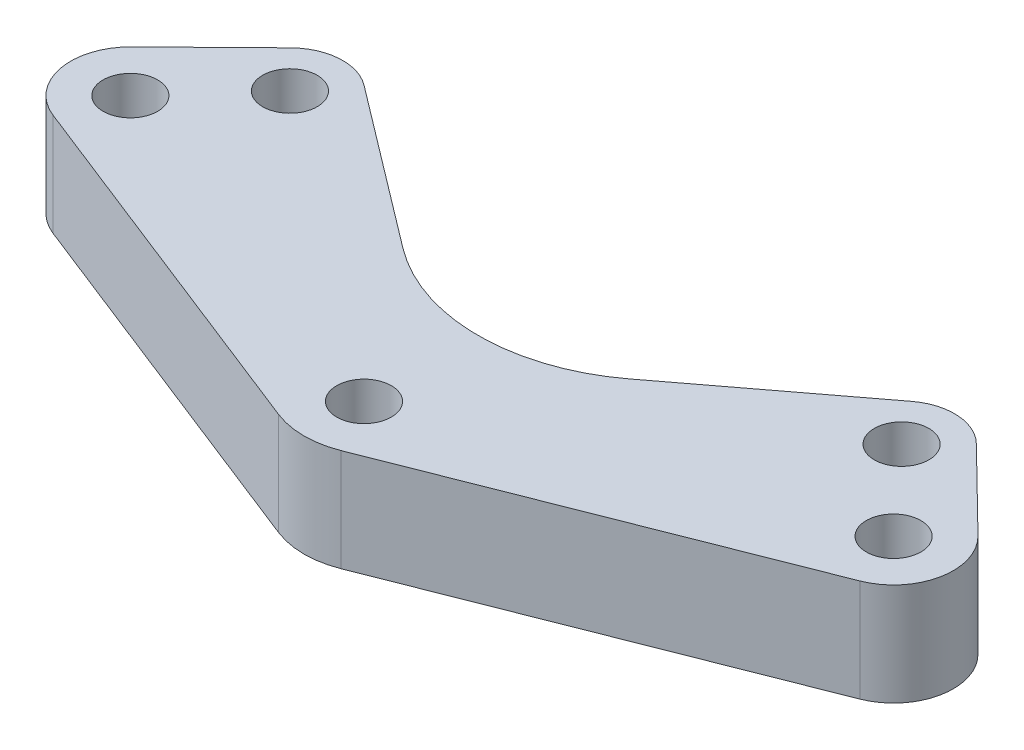
ISO-10303-21;
HEADER;
FILE_DESCRIPTION(('STEP AP214'),'2;1');
FILE_NAME('part.step','',(''),(''),'','','');
FILE_SCHEMA(('AUTOMOTIVE_DESIGN { 1 0 10303 214 1 1 1 1 }'));
ENDSEC;
DATA;
#1=APPLICATION_CONTEXT('core data for automotive mechanical design processes');
#2=APPLICATION_PROTOCOL_DEFINITION('international standard','automotive_design',2000,#1);
#3=PRODUCT_CONTEXT('',#1,'mechanical');
#4=PRODUCT('Part','Part','',(#3));
#5=PRODUCT_RELATED_PRODUCT_CATEGORY('part','',(#4));
#6=PRODUCT_DEFINITION_FORMATION('','',#4);
#7=PRODUCT_DEFINITION_CONTEXT('part definition',#1,'design');
#8=PRODUCT_DEFINITION('design','',#6,#7);
#9=PRODUCT_DEFINITION_SHAPE('','',#8);
#10=(LENGTH_UNIT() NAMED_UNIT(*) SI_UNIT(.MILLI.,.METRE.));
#11=(NAMED_UNIT(*) PLANE_ANGLE_UNIT() SI_UNIT($,.RADIAN.));
#12=(NAMED_UNIT(*) SI_UNIT($,.STERADIAN.) SOLID_ANGLE_UNIT());
#13=UNCERTAINTY_MEASURE_WITH_UNIT(LENGTH_MEASURE(1.E-05),#10,'distance_accuracy_value','');
#14=(GEOMETRIC_REPRESENTATION_CONTEXT(3) GLOBAL_UNCERTAINTY_ASSIGNED_CONTEXT((#13)) GLOBAL_UNIT_ASSIGNED_CONTEXT((#10,
#11,#12)) REPRESENTATION_CONTEXT('',''));
#15=CARTESIAN_POINT('',(0.,0.,0.));
#16=DIRECTION('',(0.,0.,1.));
#17=DIRECTION('',(1.,0.,0.));
#18=AXIS2_PLACEMENT_3D('',#15,#16,#17);
#19=CARTESIAN_POINT('',(22.3766543909561,0.,-8.67671241126073));
#20=DIRECTION('',(0.,-1.,0.));
#21=DIRECTION('',(0.,0.,-1.));
#22=AXIS2_PLACEMENT_3D('',#19,#20,#21);
#23=CYLINDRICAL_SURFACE('',#22,3.4999999999999);
#24=CARTESIAN_POINT('',(22.3766543909561,-6.,-8.67671241126073));
#25=DIRECTION('',(0.,-1.,0.));
#26=DIRECTION('',(0.,0.,-1.));
#27=AXIS2_PLACEMENT_3D('',#24,#25,#26);
#28=CIRCLE('',#27,3.4999999999999);
#29=CARTESIAN_POINT('',(24.8257440346938,-6.,-11.1771043639226));
#30=VERTEX_POINT('',#29);
#31=CARTESIAN_POINT('',(23.6582391462739,-6.,-5.41979047253755));
#32=VERTEX_POINT('',#31);
#33=EDGE_CURVE('E158',#30,#32,#28,.T.);
#34=ORIENTED_EDGE('',*,*,#33,.F.);
#35=DIRECTION('',(0.,-1.,0.));
#36=VECTOR('',#35,1.);
#37=CARTESIAN_POINT('',(24.8257440346938,0.,-11.1771043639226));
#38=LINE('',#37,#36);
#39=CARTESIAN_POINT('',(24.8257440346938,0.,-11.1771043639226));
#40=VERTEX_POINT('',#39);
#41=EDGE_CURVE('E11',#40,#30,#38,.T.);
#42=ORIENTED_EDGE('',*,*,#41,.F.);
#43=CARTESIAN_POINT('',(22.3766543909561,0.,-8.67671241126073));
#44=DIRECTION('',(0.,-1.,0.));
#45=DIRECTION('',(0.,0.,-1.));
#46=AXIS2_PLACEMENT_3D('',#43,#44,#45);
#47=CIRCLE('',#46,3.4999999999999);
#48=CARTESIAN_POINT('',(23.6582391462739,0.,-5.41979047253755));
#49=VERTEX_POINT('',#48);
#50=EDGE_CURVE('E191',#40,#49,#47,.T.);
#51=ORIENTED_EDGE('',*,*,#50,.T.);
#52=DIRECTION('',(0.,-1.,0.));
#53=VECTOR('',#52,1.);
#54=CARTESIAN_POINT('',(23.6582391462739,0.,-5.41979047253755));
#55=LINE('',#54,#53);
#56=EDGE_CURVE('E40',#49,#32,#55,.T.);
#57=ORIENTED_EDGE('',*,*,#56,.T.);
#58=EDGE_LOOP('',(#34,#42,#51,#57));
#59=FACE_BOUND('',#58,.T.);
#60=ADVANCED_FACE('F37',(#59),#23,.T.);
#61=CARTESIAN_POINT('',(20.1015148578988,0.,-15.804403191698));
#62=DIRECTION('',(0.699739898210765,0.,-0.71439770076057));
#63=DIRECTION('',(-0.71439770076057,0.,-0.699739898210765));
#64=AXIS2_PLACEMENT_3D('',#61,#62,#63);
#65=PLANE('',#64);
#66=DIRECTION('',(0.71439770076057,0.,0.699739898210765));
#67=VECTOR('',#66,1.);
#68=CARTESIAN_POINT('',(20.1015148578988,-6.,-15.804403191698));
#69=LINE('',#68,#67);
#70=CARTESIAN_POINT('',(20.1015148578988,-6.,-15.804403191698));
#71=VERTEX_POINT('',#70);
#72=EDGE_CURVE('E189',#71,#30,#69,.T.);
#73=ORIENTED_EDGE('',*,*,#72,.F.);
#74=DIRECTION('',(0.,-1.,0.));
#75=VECTOR('',#74,1.);
#76=CARTESIAN_POINT('',(20.1015148578988,0.,-15.804403191698));
#77=LINE('',#76,#75);
#78=CARTESIAN_POINT('',(20.1015148578988,0.,-15.804403191698));
#79=VERTEX_POINT('',#78);
#80=EDGE_CURVE('E46',#79,#71,#77,.T.);
#81=ORIENTED_EDGE('',*,*,#80,.F.);
#82=DIRECTION('',(0.71439770076057,0.,0.699739898210765));
#83=VECTOR('',#82,1.);
#84=CARTESIAN_POINT('',(20.1015148578988,0.,-15.804403191698));
#85=LINE('',#84,#83);
#86=EDGE_CURVE('E148',#79,#40,#85,.T.);
#87=ORIENTED_EDGE('',*,*,#86,.T.);
#88=ORIENTED_EDGE('',*,*,#41,.T.);
#89=EDGE_LOOP('',(#73,#81,#87,#88));
#90=FACE_BOUND('',#89,.T.);
#91=ADVANCED_FACE('F211',(#90),#65,.T.);
#92=CARTESIAN_POINT('',(17.9323211734452,0.,-13.58977031934));
#93=DIRECTION('',(0.,-1.,0.));
#94=DIRECTION('',(0.,0.,-1.));
#95=AXIS2_PLACEMENT_3D('',#92,#93,#94);
#96=CYLINDRICAL_SURFACE('',#95,3.10000000000038);
#97=CARTESIAN_POINT('',(17.9323211734452,-6.,-13.58977031934));
#98=DIRECTION('',(0.,-1.,0.));
#99=DIRECTION('',(0.,0.,-1.));
#100=AXIS2_PLACEMENT_3D('',#97,#98,#99);
#101=CIRCLE('',#100,3.10000000000038);
#102=CARTESIAN_POINT('',(16.0599528183358,-6.,-16.0604456810149));
#103=VERTEX_POINT('',#102);
#104=EDGE_CURVE('E135',#103,#71,#101,.T.);
#105=ORIENTED_EDGE('',*,*,#104,.F.);
#106=DIRECTION('',(0.,-1.,0.));
#107=VECTOR('',#106,1.);
#108=CARTESIAN_POINT('',(16.0599528183358,0.,-16.0604456810149));
#109=LINE('',#108,#107);
#110=CARTESIAN_POINT('',(16.0599528183358,0.,-16.0604456810149));
#111=VERTEX_POINT('',#110);
#112=EDGE_CURVE('E130',#111,#103,#109,.T.);
#113=ORIENTED_EDGE('',*,*,#112,.F.);
#114=CARTESIAN_POINT('',(17.9323211734452,0.,-13.58977031934));
#115=DIRECTION('',(0.,-1.,0.));
#116=DIRECTION('',(0.,0.,-1.));
#117=AXIS2_PLACEMENT_3D('',#114,#115,#116);
#118=CIRCLE('',#117,3.10000000000038);
#119=EDGE_CURVE('E133',#111,#79,#118,.T.);
#120=ORIENTED_EDGE('',*,*,#119,.T.);
#121=ORIENTED_EDGE('',*,*,#80,.T.);
#122=EDGE_LOOP('',(#105,#113,#120,#121));
#123=FACE_BOUND('',#122,.T.);
#124=ADVANCED_FACE('F132',(#123),#96,.T.);
#125=CARTESIAN_POINT('',(6.64388771167742,0.,-8.92460638426309));
#126=DIRECTION('',(-0.603989791970681,0.,-0.796992052153102));
#127=DIRECTION('',(-0.796992052153102,0.,0.603989791970681));
#128=AXIS2_PLACEMENT_3D('',#125,#126,#127);
#129=PLANE('',#128);
#130=DIRECTION('',(0.796992052153102,0.,-0.603989791970681));
#131=VECTOR('',#130,1.);
#132=CARTESIAN_POINT('',(6.64388771167742,-6.,-8.92460638426309));
#133=LINE('',#132,#131);
#134=CARTESIAN_POINT('',(6.64388771167742,-6.,-8.92460638426309));
#135=VERTEX_POINT('',#134);
#136=EDGE_CURVE('E186',#135,#103,#133,.T.);
#137=ORIENTED_EDGE('',*,*,#136,.F.);
#138=DIRECTION('',(0.,-1.,0.));
#139=VECTOR('',#138,1.);
#140=CARTESIAN_POINT('',(6.64388771167742,0.,-8.92460638426309));
#141=LINE('',#140,#139);
#142=CARTESIAN_POINT('',(6.64388771167742,0.,-8.92460638426309));
#143=VERTEX_POINT('',#142);
#144=EDGE_CURVE('E140',#143,#135,#141,.T.);
#145=ORIENTED_EDGE('',*,*,#144,.F.);
#146=DIRECTION('',(0.796992052153102,0.,-0.603989791970681));
#147=VECTOR('',#146,1.);
#148=CARTESIAN_POINT('',(6.64388771167742,0.,-8.92460638426309));
#149=LINE('',#148,#147);
#150=EDGE_CURVE('E146',#143,#111,#149,.T.);
#151=ORIENTED_EDGE('',*,*,#150,.T.);
#152=ORIENTED_EDGE('',*,*,#112,.T.);
#153=EDGE_LOOP('',(#137,#145,#151,#152));
#154=FACE_BOUND('',#153,.T.);
#155=ADVANCED_FACE('F150',(#154),#129,.T.);
#156=CARTESIAN_POINT('',(-1.80411241501588E-13,0.,-17.6915189579474));
#157=DIRECTION('',(0.,-1.,0.));
#158=DIRECTION('',(0.,0.,-1.));
#159=AXIS2_PLACEMENT_3D('',#156,#157,#158);
#160=CYLINDRICAL_SURFACE('',#159,11.0000000000002);
#161=CARTESIAN_POINT('',(-1.80411241501588E-13,-6.,-17.6915189579474));
#162=DIRECTION('',(0.,1.,0.));
#163=DIRECTION('',(0.,0.,1.));
#164=AXIS2_PLACEMENT_3D('',#161,#162,#163);
#165=CIRCLE('',#164,11.0000000000002);
#166=CARTESIAN_POINT('',(-6.64388771167761,-6.,-8.92460638426296));
#167=VERTEX_POINT('',#166);
#168=EDGE_CURVE('E183',#167,#135,#165,.T.);
#169=ORIENTED_EDGE('',*,*,#168,.F.);
#170=DIRECTION('',(0.,-1.,0.));
#171=VECTOR('',#170,1.);
#172=CARTESIAN_POINT('',(-6.64388771167761,0.,-8.92460638426296));
#173=LINE('',#172,#171);
#174=CARTESIAN_POINT('',(-6.64388771167761,0.,-8.92460638426296));
#175=VERTEX_POINT('',#174);
#176=EDGE_CURVE('E195',#175,#167,#173,.T.);
#177=ORIENTED_EDGE('',*,*,#176,.F.);
#178=CARTESIAN_POINT('',(-1.80411241501588E-13,0.,-17.6915189579474));
#179=DIRECTION('',(0.,1.,0.));
#180=DIRECTION('',(0.,0.,1.));
#181=AXIS2_PLACEMENT_3D('',#178,#179,#180);
#182=CIRCLE('',#181,11.0000000000002);
#183=EDGE_CURVE('E151',#175,#143,#182,.T.);
#184=ORIENTED_EDGE('',*,*,#183,.T.);
#185=ORIENTED_EDGE('',*,*,#144,.T.);
#186=EDGE_LOOP('',(#169,#177,#184,#185));
#187=FACE_BOUND('',#186,.T.);
#188=ADVANCED_FACE('F224',(#187),#160,.F.);
#189=CARTESIAN_POINT('',(-16.0599528183362,0.,-16.0604456810146));
#190=DIRECTION('',(0.603989791970665,0.,-0.796992052153114));
#191=DIRECTION('',(-0.796992052153114,0.,-0.603989791970665));
#192=AXIS2_PLACEMENT_3D('',#189,#190,#191);
#193=PLANE('',#192);
#194=DIRECTION('',(0.796992052153114,0.,0.603989791970665));
#195=VECTOR('',#194,1.);
#196=CARTESIAN_POINT('',(-16.0599528183362,-6.,-16.0604456810146));
#197=LINE('',#196,#195);
#198=CARTESIAN_POINT('',(-16.0599528183362,-6.,-16.0604456810146));
#199=VERTEX_POINT('',#198);
#200=EDGE_CURVE('E180',#199,#167,#197,.T.);
#201=ORIENTED_EDGE('',*,*,#200,.F.);
#202=DIRECTION('',(0.,-1.,0.));
#203=VECTOR('',#202,1.);
#204=CARTESIAN_POINT('',(-16.0599528183362,0.,-16.0604456810146));
#205=LINE('',#204,#203);
#206=CARTESIAN_POINT('',(-16.0599528183362,0.,-16.0604456810146));
#207=VERTEX_POINT('',#206);
#208=EDGE_CURVE('E197',#207,#199,#205,.T.);
#209=ORIENTED_EDGE('',*,*,#208,.F.);
#210=DIRECTION('',(0.796992052153114,0.,0.603989791970665));
#211=VECTOR('',#210,1.);
#212=CARTESIAN_POINT('',(-16.0599528183362,0.,-16.0604456810146));
#213=LINE('',#212,#211);
#214=EDGE_CURVE('E153',#207,#175,#213,.T.);
#215=ORIENTED_EDGE('',*,*,#214,.T.);
#216=ORIENTED_EDGE('',*,*,#176,.T.);
#217=EDGE_LOOP('',(#201,#209,#215,#216));
#218=FACE_BOUND('',#217,.T.);
#219=ADVANCED_FACE('F227',(#218),#193,.T.);
#220=CARTESIAN_POINT('',(-17.9323211734452,0.,-13.58977031934));
#221=DIRECTION('',(0.,-1.,0.));
#222=DIRECTION('',(0.,0.,-1.));
#223=AXIS2_PLACEMENT_3D('',#220,#221,#222);
#224=CYLINDRICAL_SURFACE('',#223,3.09999999999993);
#225=CARTESIAN_POINT('',(-17.9323211734452,-6.,-13.58977031934));
#226=DIRECTION('',(0.,-1.,0.));
#227=DIRECTION('',(0.,0.,-1.));
#228=AXIS2_PLACEMENT_3D('',#225,#226,#227);
#229=CIRCLE('',#228,3.09999999999993);
#230=CARTESIAN_POINT('',(-20.1015148578983,-6.,-15.8044031916979));
#231=VERTEX_POINT('',#230);
#232=EDGE_CURVE('E177',#231,#199,#229,.T.);
#233=ORIENTED_EDGE('',*,*,#232,.F.);
#234=DIRECTION('',(0.,-1.,0.));
#235=VECTOR('',#234,1.);
#236=CARTESIAN_POINT('',(-20.1015148578983,0.,-15.8044031916979));
#237=LINE('',#236,#235);
#238=CARTESIAN_POINT('',(-20.1015148578983,0.,-15.8044031916979));
#239=VERTEX_POINT('',#238);
#240=EDGE_CURVE('E199',#239,#231,#237,.T.);
#241=ORIENTED_EDGE('',*,*,#240,.F.);
#242=CARTESIAN_POINT('',(-17.9323211734452,0.,-13.58977031934));
#243=DIRECTION('',(0.,-1.,0.));
#244=DIRECTION('',(0.,0.,-1.));
#245=AXIS2_PLACEMENT_3D('',#242,#243,#244);
#246=CIRCLE('',#245,3.09999999999993);
#247=EDGE_CURVE('E331',#239,#207,#246,.T.);
#248=ORIENTED_EDGE('',*,*,#247,.T.);
#249=ORIENTED_EDGE('',*,*,#208,.T.);
#250=EDGE_LOOP('',(#233,#241,#248,#249));
#251=FACE_BOUND('',#250,.T.);
#252=ADVANCED_FACE('F231',(#251),#224,.T.);
#253=CARTESIAN_POINT('',(-24.8257440346936,0.,-11.1771043639229));
#254=DIRECTION('',(-0.699739898210706,0.,-0.714397700760627));
#255=DIRECTION('',(-0.714397700760627,0.,0.699739898210707));
#256=AXIS2_PLACEMENT_3D('',#253,#254,#255);
#257=PLANE('',#256);
#258=DIRECTION('',(0.714397700760627,0.,-0.699739898210707));
#259=VECTOR('',#258,1.);
#260=CARTESIAN_POINT('',(-24.8257440346936,-6.,-11.1771043639229));
#261=LINE('',#260,#259);
#262=CARTESIAN_POINT('',(-24.8257440346936,-6.,-11.1771043639229));
#263=VERTEX_POINT('',#262);
#264=EDGE_CURVE('E174',#263,#231,#261,.T.);
#265=ORIENTED_EDGE('',*,*,#264,.F.);
#266=DIRECTION('',(0.,-1.,0.));
#267=VECTOR('',#266,1.);
#268=CARTESIAN_POINT('',(-24.8257440346936,0.,-11.1771043639229));
#269=LINE('',#268,#267);
#270=CARTESIAN_POINT('',(-24.8257440346936,0.,-11.1771043639229));
#271=VERTEX_POINT('',#270);
#272=EDGE_CURVE('E201',#271,#263,#269,.T.);
#273=ORIENTED_EDGE('',*,*,#272,.F.);
#274=DIRECTION('',(0.714397700760627,0.,-0.699739898210707));
#275=VECTOR('',#274,1.);
#276=CARTESIAN_POINT('',(-24.8257440346936,0.,-11.1771043639229));
#277=LINE('',#276,#275);
#278=EDGE_CURVE('E328',#271,#239,#277,.T.);
#279=ORIENTED_EDGE('',*,*,#278,.T.);
#280=ORIENTED_EDGE('',*,*,#240,.T.);
#281=EDGE_LOOP('',(#265,#273,#279,#280));
#282=FACE_BOUND('',#281,.T.);
#283=ADVANCED_FACE('F235',(#282),#257,.T.);
#284=CARTESIAN_POINT('',(-22.3766543909561,0.,-8.67671241126073));
#285=DIRECTION('',(0.,-1.,0.));
#286=DIRECTION('',(0.,0.,-1.));
#287=AXIS2_PLACEMENT_3D('',#284,#285,#286);
#288=CYLINDRICAL_SURFACE('',#287,3.49999999999999);
#289=CARTESIAN_POINT('',(-22.3766543909561,-6.,-8.67671241126073));
#290=DIRECTION('',(0.,-1.,0.));
#291=DIRECTION('',(0.,0.,-1.));
#292=AXIS2_PLACEMENT_3D('',#289,#290,#291);
#293=CIRCLE('',#292,3.49999999999999);
#294=CARTESIAN_POINT('',(-23.658239146274,-6.,-5.41979047253749));
#295=VERTEX_POINT('',#294);
#296=EDGE_CURVE('E171',#295,#263,#293,.T.);
#297=ORIENTED_EDGE('',*,*,#296,.F.);
#298=DIRECTION('',(0.,-1.,0.));
#299=VECTOR('',#298,1.);
#300=CARTESIAN_POINT('',(-23.658239146274,0.,-5.41979047253749));
#301=LINE('',#300,#299);
#302=CARTESIAN_POINT('',(-23.658239146274,0.,-5.41979047253749));
#303=VERTEX_POINT('',#302);
#304=EDGE_CURVE('E203',#303,#295,#301,.T.);
#305=ORIENTED_EDGE('',*,*,#304,.F.);
#306=CARTESIAN_POINT('',(-22.3766543909561,0.,-8.67671241126073));
#307=DIRECTION('',(0.,-1.,0.));
#308=DIRECTION('',(0.,0.,-1.));
#309=AXIS2_PLACEMENT_3D('',#306,#307,#308);
#310=CIRCLE('',#309,3.49999999999999);
#311=EDGE_CURVE('E325',#303,#271,#310,.T.);
#312=ORIENTED_EDGE('',*,*,#311,.T.);
#313=ORIENTED_EDGE('',*,*,#272,.T.);
#314=EDGE_LOOP('',(#297,#305,#312,#313));
#315=FACE_BOUND('',#314,.T.);
#316=ADVANCED_FACE('F239',(#315),#288,.T.);
#317=CARTESIAN_POINT('',(-1.83083536474049,0.,3.16919890482149));
#318=DIRECTION('',(-0.366167072947968,0.,0.930549125349499));
#319=DIRECTION('',(0.930549125349499,0.,0.366167072947968));
#320=AXIS2_PLACEMENT_3D('',#317,#318,#319);
#321=PLANE('',#320);
#322=DIRECTION('',(-0.930549125349499,0.,-0.366167072947968));
#323=VECTOR('',#322,1.);
#324=CARTESIAN_POINT('',(-1.83083536474049,-6.,3.16919890482149));
#325=LINE('',#324,#323);
#326=CARTESIAN_POINT('',(-1.83083536474049,-6.,3.16919890482149));
#327=VERTEX_POINT('',#326);
#328=EDGE_CURVE('E168',#327,#295,#325,.T.);
#329=ORIENTED_EDGE('',*,*,#328,.F.);
#330=DIRECTION('',(0.,-1.,0.));
#331=VECTOR('',#330,1.);
#332=CARTESIAN_POINT('',(-1.83083536474049,0.,3.16919890482149));
#333=LINE('',#332,#331);
#334=CARTESIAN_POINT('',(-1.83083536474049,0.,3.16919890482149));
#335=VERTEX_POINT('',#334);
#336=EDGE_CURVE('E205',#335,#327,#333,.T.);
#337=ORIENTED_EDGE('',*,*,#336,.F.);
#338=DIRECTION('',(-0.930549125349499,0.,-0.366167072947968));
#339=VECTOR('',#338,1.);
#340=CARTESIAN_POINT('',(-1.83083536474049,0.,3.16919890482149));
#341=LINE('',#340,#339);
#342=EDGE_CURVE('E322',#335,#303,#341,.T.);
#343=ORIENTED_EDGE('',*,*,#342,.T.);
#344=ORIENTED_EDGE('',*,*,#304,.T.);
#345=EDGE_LOOP('',(#329,#337,#343,#344));
#346=FACE_BOUND('',#345,.T.);
#347=ADVANCED_FACE('F243',(#346),#321,.T.);
#348=CARTESIAN_POINT('',(-6.45317133063372E-13,0.,-1.48354672192603));
#349=DIRECTION('',(0.,-1.,0.));
#350=DIRECTION('',(0.,0.,-1.));
#351=AXIS2_PLACEMENT_3D('',#348,#349,#350);
#352=CYLINDRICAL_SURFACE('',#351,5.00000000000002);
#353=CARTESIAN_POINT('',(-6.45317133063372E-13,-6.,-1.48354672192603));
#354=DIRECTION('',(0.,-1.,0.));
#355=DIRECTION('',(0.,0.,-1.));
#356=AXIS2_PLACEMENT_3D('',#353,#354,#355);
#357=CIRCLE('',#356,5.00000000000002);
#358=CARTESIAN_POINT('',(1.83083536473912,-6.,3.16919890482151));
#359=VERTEX_POINT('',#358);
#360=EDGE_CURVE('E165',#359,#327,#357,.T.);
#361=ORIENTED_EDGE('',*,*,#360,.F.);
#362=DIRECTION('',(0.,-1.,0.));
#363=VECTOR('',#362,1.);
#364=CARTESIAN_POINT('',(1.83083536473912,0.,3.16919890482151));
#365=LINE('',#364,#363);
#366=CARTESIAN_POINT('',(1.83083536473912,0.,3.16919890482151));
#367=VERTEX_POINT('',#366);
#368=EDGE_CURVE('E206',#367,#359,#365,.T.);
#369=ORIENTED_EDGE('',*,*,#368,.F.);
#370=CARTESIAN_POINT('',(-6.45317133063372E-13,0.,-1.48354672192603));
#371=DIRECTION('',(0.,-1.,0.));
#372=DIRECTION('',(0.,0.,-1.));
#373=AXIS2_PLACEMENT_3D('',#370,#371,#372);
#374=CIRCLE('',#373,5.00000000000002);
#375=EDGE_CURVE('E319',#367,#335,#374,.T.);
#376=ORIENTED_EDGE('',*,*,#375,.T.);
#377=ORIENTED_EDGE('',*,*,#336,.T.);
#378=EDGE_LOOP('',(#361,#369,#376,#377));
#379=FACE_BOUND('',#378,.T.);
#380=ADVANCED_FACE('F247',(#379),#352,.T.);
#381=CARTESIAN_POINT('',(23.6582391462739,0.,-5.41979047253755));
#382=DIRECTION('',(0.366167072947952,0.,0.930549125349505));
#383=DIRECTION('',(0.930549125349505,0.,-0.366167072947952));
#384=AXIS2_PLACEMENT_3D('',#381,#382,#383);
#385=PLANE('',#384);
#386=DIRECTION('',(-0.930549125349505,0.,0.366167072947952));
#387=VECTOR('',#386,1.);
#388=CARTESIAN_POINT('',(23.6582391462739,-6.,-5.41979047253755));
#389=LINE('',#388,#387);
#390=EDGE_CURVE('E161',#32,#359,#389,.T.);
#391=ORIENTED_EDGE('',*,*,#390,.F.);
#392=ORIENTED_EDGE('',*,*,#56,.F.);
#393=DIRECTION('',(-0.930549125349505,0.,0.366167072947952));
#394=VECTOR('',#393,1.);
#395=CARTESIAN_POINT('',(23.6582391462739,0.,-5.41979047253755));
#396=LINE('',#395,#394);
#397=EDGE_CURVE('E317',#49,#367,#396,.T.);
#398=ORIENTED_EDGE('',*,*,#397,.T.);
#399=ORIENTED_EDGE('',*,*,#368,.T.);
#400=EDGE_LOOP('',(#391,#392,#398,#399));
#401=FACE_BOUND('',#400,.T.);
#402=ADVANCED_FACE('F208',(#401),#385,.T.);
#403=CARTESIAN_POINT('',(22.3766543909561,0.,-8.67671241126073));
#404=DIRECTION('',(0.,-1.,0.));
#405=DIRECTION('',(0.,0.,-1.));
#406=AXIS2_PLACEMENT_3D('',#403,#404,#405);
#407=PLANE('',#406);
#408=CARTESIAN_POINT('',(22.3766543909561,0.,-8.67671241126073));
#409=DIRECTION('',(0.,-1.,0.));
#410=DIRECTION('',(0.,0.,1.));
#411=AXIS2_PLACEMENT_3D('',#408,#409,#410);
#412=CIRCLE('',#411,1.6);
#413=CARTESIAN_POINT('',(22.3766543909561,0.,-7.07671241126072));
#414=VERTEX_POINT('',#413);
#415=EDGE_CURVE('E286',#414,#414,#412,.T.);
#416=ORIENTED_EDGE('',*,*,#415,.T.);
#417=EDGE_LOOP('',(#416));
#418=FACE_BOUND('',#417,.T.);
#419=CARTESIAN_POINT('',(-22.3766543909561,0.,-8.67671241126073));
#420=DIRECTION('',(0.,-1.,0.));
#421=DIRECTION('',(0.,0.,1.));
#422=AXIS2_PLACEMENT_3D('',#419,#420,#421);
#423=CIRCLE('',#422,1.6);
#424=CARTESIAN_POINT('',(-22.3766543909561,0.,-7.07671241126072));
#425=VERTEX_POINT('',#424);
#426=EDGE_CURVE('E294',#425,#425,#423,.T.);
#427=ORIENTED_EDGE('',*,*,#426,.T.);
#428=EDGE_LOOP('',(#427));
#429=FACE_BOUND('',#428,.T.);
#430=CARTESIAN_POINT('',(17.9323211734452,0.,-13.58977031934));
#431=DIRECTION('',(0.,-1.,0.));
#432=DIRECTION('',(0.,0.,1.));
#433=AXIS2_PLACEMENT_3D('',#430,#431,#432);
#434=CIRCLE('',#433,1.60000000000001);
#435=CARTESIAN_POINT('',(17.9323211734452,0.,-11.98977031934));
#436=VERTEX_POINT('',#435);
#437=EDGE_CURVE('E300',#436,#436,#434,.T.);
#438=ORIENTED_EDGE('',*,*,#437,.T.);
#439=EDGE_LOOP('',(#438));
#440=FACE_BOUND('',#439,.T.);
#441=CARTESIAN_POINT('',(0.,0.,0.));
#442=DIRECTION('',(0.,-1.,0.));
#443=DIRECTION('',(0.,0.,1.));
#444=AXIS2_PLACEMENT_3D('',#441,#442,#443);
#445=CIRCLE('',#444,1.60000000000001);
#446=CARTESIAN_POINT('',(0.,0.,1.60000000000001));
#447=VERTEX_POINT('',#446);
#448=EDGE_CURVE('E306',#447,#447,#445,.T.);
#449=ORIENTED_EDGE('',*,*,#448,.T.);
#450=EDGE_LOOP('',(#449));
#451=FACE_BOUND('',#450,.T.);
#452=CARTESIAN_POINT('',(-17.9323211734452,0.,-13.58977031934));
#453=DIRECTION('',(0.,-1.,0.));
#454=DIRECTION('',(0.,0.,1.));
#455=AXIS2_PLACEMENT_3D('',#452,#453,#454);
#456=CIRCLE('',#455,1.6);
#457=CARTESIAN_POINT('',(-17.9323211734452,0.,-11.98977031934));
#458=VERTEX_POINT('',#457);
#459=EDGE_CURVE('E162',#458,#458,#456,.T.);
#460=ORIENTED_EDGE('',*,*,#459,.T.);
#461=EDGE_LOOP('',(#460));
#462=FACE_BOUND('',#461,.T.);
#463=ORIENTED_EDGE('',*,*,#50,.F.);
#464=ORIENTED_EDGE('',*,*,#86,.F.);
#465=ORIENTED_EDGE('',*,*,#119,.F.);
#466=ORIENTED_EDGE('',*,*,#150,.F.);
#467=ORIENTED_EDGE('',*,*,#183,.F.);
#468=ORIENTED_EDGE('',*,*,#214,.F.);
#469=ORIENTED_EDGE('',*,*,#247,.F.);
#470=ORIENTED_EDGE('',*,*,#278,.F.);
#471=ORIENTED_EDGE('',*,*,#311,.F.);
#472=ORIENTED_EDGE('',*,*,#342,.F.);
#473=ORIENTED_EDGE('',*,*,#375,.F.);
#474=ORIENTED_EDGE('',*,*,#397,.F.);
#475=EDGE_LOOP('',(#463,#464,#465,#466,#467,#468,#469,#470,#471,#472,#473,#474));
#476=FACE_BOUND('',#475,.T.);
#477=ADVANCED_FACE('F144',(#418,#429,#440,#451,#462,#476),#407,.F.);
#478=CARTESIAN_POINT('',(22.3766543909561,-6.,-8.67671241126073));
#479=DIRECTION('',(0.,-1.,0.));
#480=DIRECTION('',(0.,0.,-1.));
#481=AXIS2_PLACEMENT_3D('',#478,#479,#480);
#482=PLANE('',#481);
#483=CARTESIAN_POINT('',(22.3766543909561,-6.,-8.67671241126073));
#484=DIRECTION('',(0.,-1.,0.));
#485=DIRECTION('',(0.,0.,1.));
#486=AXIS2_PLACEMENT_3D('',#483,#484,#485);
#487=CIRCLE('',#486,1.6);
#488=CARTESIAN_POINT('',(22.3766543909561,-6.,-7.07671241126072));
#489=VERTEX_POINT('',#488);
#490=EDGE_CURVE('E289',#489,#489,#487,.T.);
#491=ORIENTED_EDGE('',*,*,#490,.F.);
#492=EDGE_LOOP('',(#491));
#493=FACE_BOUND('',#492,.T.);
#494=CARTESIAN_POINT('',(-22.3766543909561,-6.,-8.67671241126073));
#495=DIRECTION('',(0.,-1.,0.));
#496=DIRECTION('',(0.,0.,1.));
#497=AXIS2_PLACEMENT_3D('',#494,#495,#496);
#498=CIRCLE('',#497,1.6);
#499=CARTESIAN_POINT('',(-22.3766543909561,-6.,-7.07671241126072));
#500=VERTEX_POINT('',#499);
#501=EDGE_CURVE('E291',#500,#500,#498,.T.);
#502=ORIENTED_EDGE('',*,*,#501,.F.);
#503=EDGE_LOOP('',(#502));
#504=FACE_BOUND('',#503,.T.);
#505=CARTESIAN_POINT('',(17.9323211734452,-6.,-13.58977031934));
#506=DIRECTION('',(0.,-1.,0.));
#507=DIRECTION('',(0.,0.,1.));
#508=AXIS2_PLACEMENT_3D('',#505,#506,#507);
#509=CIRCLE('',#508,1.60000000000001);
#510=CARTESIAN_POINT('',(17.9323211734452,-6.,-11.98977031934));
#511=VERTEX_POINT('',#510);
#512=EDGE_CURVE('E297',#511,#511,#509,.T.);
#513=ORIENTED_EDGE('',*,*,#512,.F.);
#514=EDGE_LOOP('',(#513));
#515=FACE_BOUND('',#514,.T.);
#516=CARTESIAN_POINT('',(0.,-6.,0.));
#517=DIRECTION('',(0.,-1.,0.));
#518=DIRECTION('',(0.,0.,1.));
#519=AXIS2_PLACEMENT_3D('',#516,#517,#518);
#520=CIRCLE('',#519,1.60000000000001);
#521=CARTESIAN_POINT('',(0.,-6.,1.60000000000001));
#522=VERTEX_POINT('',#521);
#523=EDGE_CURVE('E303',#522,#522,#520,.T.);
#524=ORIENTED_EDGE('',*,*,#523,.F.);
#525=EDGE_LOOP('',(#524));
#526=FACE_BOUND('',#525,.T.);
#527=CARTESIAN_POINT('',(-17.9323211734452,-6.,-13.58977031934));
#528=DIRECTION('',(0.,-1.,0.));
#529=DIRECTION('',(0.,0.,1.));
#530=AXIS2_PLACEMENT_3D('',#527,#528,#529);
#531=CIRCLE('',#530,1.6);
#532=CARTESIAN_POINT('',(-17.9323211734452,-6.,-11.98977031934));
#533=VERTEX_POINT('',#532);
#534=EDGE_CURVE('E309',#533,#533,#531,.T.);
#535=ORIENTED_EDGE('',*,*,#534,.F.);
#536=EDGE_LOOP('',(#535));
#537=FACE_BOUND('',#536,.T.);
#538=ORIENTED_EDGE('',*,*,#33,.T.);
#539=ORIENTED_EDGE('',*,*,#390,.T.);
#540=ORIENTED_EDGE('',*,*,#360,.T.);
#541=ORIENTED_EDGE('',*,*,#328,.T.);
#542=ORIENTED_EDGE('',*,*,#296,.T.);
#543=ORIENTED_EDGE('',*,*,#264,.T.);
#544=ORIENTED_EDGE('',*,*,#232,.T.);
#545=ORIENTED_EDGE('',*,*,#200,.T.);
#546=ORIENTED_EDGE('',*,*,#168,.T.);
#547=ORIENTED_EDGE('',*,*,#136,.T.);
#548=ORIENTED_EDGE('',*,*,#104,.T.);
#549=ORIENTED_EDGE('',*,*,#72,.T.);
#550=EDGE_LOOP('',(#538,#539,#540,#541,#542,#543,#544,#545,#546,#547,#548,#549));
#551=FACE_BOUND('',#550,.T.);
#552=ADVANCED_FACE('F210',(#493,#504,#515,#526,#537,#551),#482,.T.);
#553=CARTESIAN_POINT('',(-17.9323211734452,0.,-13.58977031934));
#554=DIRECTION('',(0.,-1.,0.));
#555=DIRECTION('',(0.,0.,-1.));
#556=AXIS2_PLACEMENT_3D('',#553,#554,#555);
#557=CYLINDRICAL_SURFACE('',#556,1.6);
#558=ORIENTED_EDGE('',*,*,#459,.F.);
#559=EDGE_LOOP('',(#558));
#560=FACE_BOUND('',#559,.T.);
#561=ORIENTED_EDGE('',*,*,#534,.T.);
#562=EDGE_LOOP('',(#561));
#563=FACE_BOUND('',#562,.T.);
#564=ADVANCED_FACE('F259',(#560,#563),#557,.F.);
#565=CARTESIAN_POINT('',(0.,0.,0.));
#566=DIRECTION('',(0.,-1.,0.));
#567=DIRECTION('',(0.,0.,-1.));
#568=AXIS2_PLACEMENT_3D('',#565,#566,#567);
#569=CYLINDRICAL_SURFACE('',#568,1.60000000000001);
#570=ORIENTED_EDGE('',*,*,#448,.F.);
#571=EDGE_LOOP('',(#570));
#572=FACE_BOUND('',#571,.T.);
#573=ORIENTED_EDGE('',*,*,#523,.T.);
#574=EDGE_LOOP('',(#573));
#575=FACE_BOUND('',#574,.T.);
#576=ADVANCED_FACE('F266',(#572,#575),#569,.F.);
#577=CARTESIAN_POINT('',(17.9323211734452,0.,-13.58977031934));
#578=DIRECTION('',(0.,-1.,0.));
#579=DIRECTION('',(0.,0.,-1.));
#580=AXIS2_PLACEMENT_3D('',#577,#578,#579);
#581=CYLINDRICAL_SURFACE('',#580,1.60000000000001);
#582=ORIENTED_EDGE('',*,*,#437,.F.);
#583=EDGE_LOOP('',(#582));
#584=FACE_BOUND('',#583,.T.);
#585=ORIENTED_EDGE('',*,*,#512,.T.);
#586=EDGE_LOOP('',(#585));
#587=FACE_BOUND('',#586,.T.);
#588=ADVANCED_FACE('F270',(#584,#587),#581,.F.);
#589=CARTESIAN_POINT('',(-22.3766543909561,0.,-8.67671241126073));
#590=DIRECTION('',(0.,-1.,0.));
#591=DIRECTION('',(0.,0.,-1.));
#592=AXIS2_PLACEMENT_3D('',#589,#590,#591);
#593=CYLINDRICAL_SURFACE('',#592,1.6);
#594=ORIENTED_EDGE('',*,*,#426,.F.);
#595=EDGE_LOOP('',(#594));
#596=FACE_BOUND('',#595,.T.);
#597=ORIENTED_EDGE('',*,*,#501,.T.);
#598=EDGE_LOOP('',(#597));
#599=FACE_BOUND('',#598,.T.);
#600=ADVANCED_FACE('F274',(#596,#599),#593,.F.);
#601=CARTESIAN_POINT('',(22.3766543909561,0.,-8.67671241126073));
#602=DIRECTION('',(0.,-1.,0.));
#603=DIRECTION('',(0.,0.,-1.));
#604=AXIS2_PLACEMENT_3D('',#601,#602,#603);
#605=CYLINDRICAL_SURFACE('',#604,1.6);
#606=ORIENTED_EDGE('',*,*,#415,.F.);
#607=EDGE_LOOP('',(#606));
#608=FACE_BOUND('',#607,.T.);
#609=ORIENTED_EDGE('',*,*,#490,.T.);
#610=EDGE_LOOP('',(#609));
#611=FACE_BOUND('',#610,.T.);
#612=ADVANCED_FACE('F278',(#608,#611),#605,.F.);
#613=CLOSED_SHELL('',(#60,#91,#124,#155,#188,#219,#252,#283,#316,#347,#380,#402,#477,#552,#564,
#576,#588,#600,#612));
#614=MANIFOLD_SOLID_BREP('B2',#613);
#615=ADVANCED_BREP_SHAPE_REPRESENTATION('',(#18,#614),#14);
#616=SHAPE_DEFINITION_REPRESENTATION(#9,#615);
ENDSEC;
END-ISO-10303-21;
